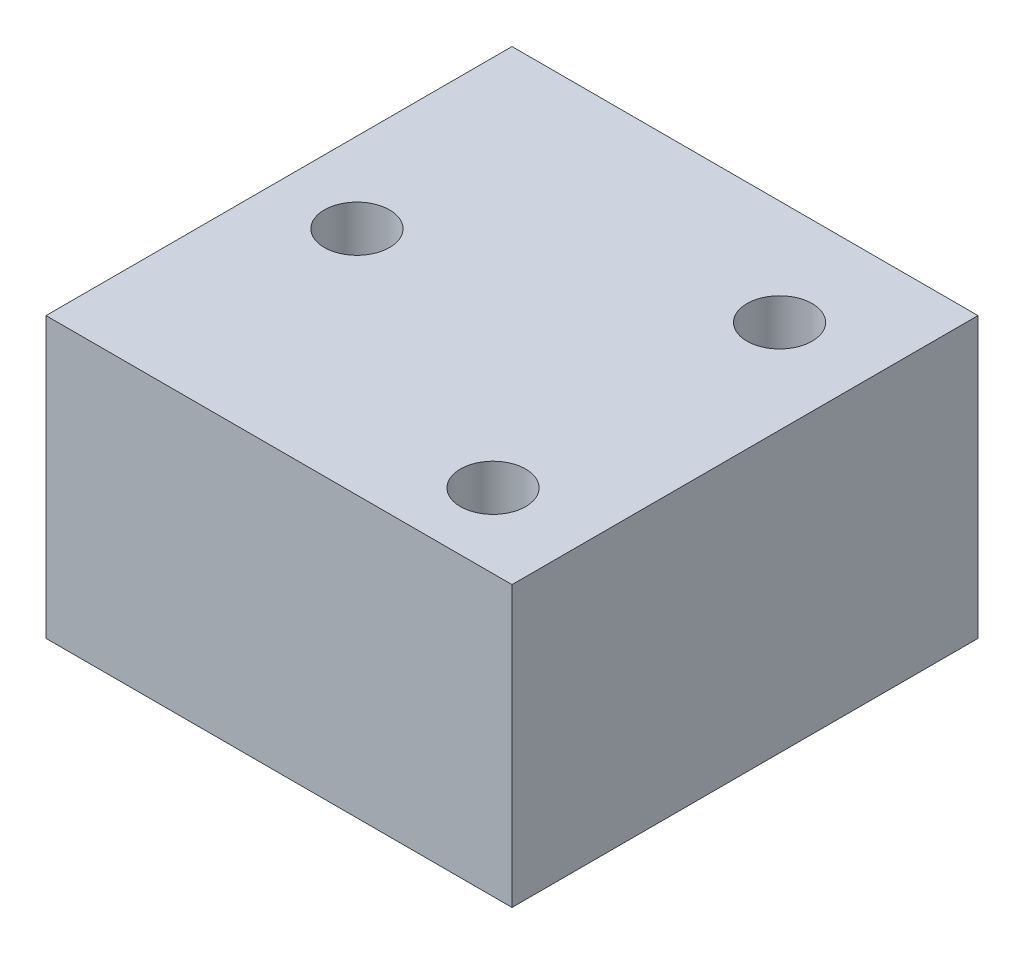
ISO-10303-21;
HEADER;
FILE_DESCRIPTION(('STEP AP214'),'2;1');
FILE_NAME('part.step','',(''),(''),'','','');
FILE_SCHEMA(('AUTOMOTIVE_DESIGN { 1 0 10303 214 1 1 1 1 }'));
ENDSEC;
DATA;
#1=APPLICATION_CONTEXT('core data for automotive mechanical design processes');
#2=APPLICATION_PROTOCOL_DEFINITION('international standard','automotive_design',2000,#1);
#3=PRODUCT_CONTEXT('',#1,'mechanical');
#4=PRODUCT('Part','Part','',(#3));
#5=PRODUCT_RELATED_PRODUCT_CATEGORY('part','',(#4));
#6=PRODUCT_DEFINITION_FORMATION('','',#4);
#7=PRODUCT_DEFINITION_CONTEXT('part definition',#1,'design');
#8=PRODUCT_DEFINITION('design','',#6,#7);
#9=PRODUCT_DEFINITION_SHAPE('','',#8);
#10=(LENGTH_UNIT() NAMED_UNIT(*) SI_UNIT(.MILLI.,.METRE.));
#11=(NAMED_UNIT(*) PLANE_ANGLE_UNIT() SI_UNIT($,.RADIAN.));
#12=(NAMED_UNIT(*) SI_UNIT($,.STERADIAN.) SOLID_ANGLE_UNIT());
#13=UNCERTAINTY_MEASURE_WITH_UNIT(LENGTH_MEASURE(1.E-05),#10,'distance_accuracy_value','');
#14=(GEOMETRIC_REPRESENTATION_CONTEXT(3) GLOBAL_UNCERTAINTY_ASSIGNED_CONTEXT((#13)) GLOBAL_UNIT_ASSIGNED_CONTEXT((#10,
#11,#12)) REPRESENTATION_CONTEXT('',''));
#15=CARTESIAN_POINT('',(0.,0.,0.));
#16=DIRECTION('',(0.,0.,1.));
#17=DIRECTION('',(1.,0.,0.));
#18=AXIS2_PLACEMENT_3D('',#15,#16,#17);
#19=CARTESIAN_POINT('',(0.,30.,0.));
#20=DIRECTION('',(1.,0.,0.));
#21=DIRECTION('',(0.,0.,-1.));
#22=AXIS2_PLACEMENT_3D('',#19,#20,#21);
#23=PLANE('',#22);
#24=DIRECTION('',(0.,0.,1.));
#25=VECTOR('',#24,1.);
#26=CARTESIAN_POINT('',(0.,0.,0.));
#27=LINE('',#26,#25);
#28=CARTESIAN_POINT('',(0.,0.,-50.));
#29=VERTEX_POINT('',#28);
#30=CARTESIAN_POINT('',(0.,0.,0.));
#31=VERTEX_POINT('',#30);
#32=EDGE_CURVE('E107',#29,#31,#27,.T.);
#33=ORIENTED_EDGE('',*,*,#32,.T.);
#34=DIRECTION('',(0.,-1.,0.));
#35=VECTOR('',#34,1.);
#36=CARTESIAN_POINT('',(0.,30.,0.));
#37=LINE('',#36,#35);
#38=CARTESIAN_POINT('',(0.,30.,0.));
#39=VERTEX_POINT('',#38);
#40=EDGE_CURVE('E11',#39,#31,#37,.T.);
#41=ORIENTED_EDGE('',*,*,#40,.F.);
#42=DIRECTION('',(0.,0.,1.));
#43=VECTOR('',#42,1.);
#44=CARTESIAN_POINT('',(0.,30.,0.));
#45=LINE('',#44,#43);
#46=CARTESIAN_POINT('',(0.,30.,-50.));
#47=VERTEX_POINT('',#46);
#48=EDGE_CURVE('E91',#47,#39,#45,.T.);
#49=ORIENTED_EDGE('',*,*,#48,.F.);
#50=DIRECTION('',(0.,-1.,0.));
#51=VECTOR('',#50,1.);
#52=CARTESIAN_POINT('',(0.,30.,-50.));
#53=LINE('',#52,#51);
#54=EDGE_CURVE('E103',#47,#29,#53,.T.);
#55=ORIENTED_EDGE('',*,*,#54,.T.);
#56=EDGE_LOOP('',(#33,#41,#49,#55));
#57=FACE_BOUND('',#56,.T.);
#58=ADVANCED_FACE('F39',(#57),#23,.F.);
#59=CARTESIAN_POINT('',(0.,30.,0.));
#60=DIRECTION('',(0.,0.,-1.));
#61=DIRECTION('',(-1.,0.,0.));
#62=AXIS2_PLACEMENT_3D('',#59,#60,#61);
#63=PLANE('',#62);
#64=DIRECTION('',(1.,0.,0.));
#65=VECTOR('',#64,1.);
#66=CARTESIAN_POINT('',(0.,0.,0.));
#67=LINE('',#66,#65);
#68=CARTESIAN_POINT('',(50.,0.,0.));
#69=VERTEX_POINT('',#68);
#70=EDGE_CURVE('E96',#31,#69,#67,.T.);
#71=ORIENTED_EDGE('',*,*,#70,.T.);
#72=DIRECTION('',(0.,-1.,0.));
#73=VECTOR('',#72,1.);
#74=CARTESIAN_POINT('',(50.,30.,0.));
#75=LINE('',#74,#73);
#76=CARTESIAN_POINT('',(50.,30.,0.));
#77=VERTEX_POINT('',#76);
#78=EDGE_CURVE('E48',#77,#69,#75,.T.);
#79=ORIENTED_EDGE('',*,*,#78,.F.);
#80=DIRECTION('',(1.,0.,0.));
#81=VECTOR('',#80,1.);
#82=CARTESIAN_POINT('',(0.,30.,0.));
#83=LINE('',#82,#81);
#84=EDGE_CURVE('E86',#39,#77,#83,.T.);
#85=ORIENTED_EDGE('',*,*,#84,.F.);
#86=ORIENTED_EDGE('',*,*,#40,.T.);
#87=EDGE_LOOP('',(#71,#79,#85,#86));
#88=FACE_BOUND('',#87,.T.);
#89=ADVANCED_FACE('F95',(#88),#63,.F.);
#90=CARTESIAN_POINT('',(50.,30.,0.));
#91=DIRECTION('',(-1.,0.,0.));
#92=DIRECTION('',(0.,0.,1.));
#93=AXIS2_PLACEMENT_3D('',#90,#91,#92);
#94=PLANE('',#93);
#95=DIRECTION('',(0.,0.,-1.));
#96=VECTOR('',#95,1.);
#97=CARTESIAN_POINT('',(50.,0.,0.));
#98=LINE('',#97,#96);
#99=CARTESIAN_POINT('',(50.,0.,-50.));
#100=VERTEX_POINT('',#99);
#101=EDGE_CURVE('E73',#69,#100,#98,.T.);
#102=ORIENTED_EDGE('',*,*,#101,.T.);
#103=DIRECTION('',(0.,-1.,0.));
#104=VECTOR('',#103,1.);
#105=CARTESIAN_POINT('',(50.,30.,-50.));
#106=LINE('',#105,#104);
#107=CARTESIAN_POINT('',(50.,30.,-50.));
#108=VERTEX_POINT('',#107);
#109=EDGE_CURVE('E98',#108,#100,#106,.T.);
#110=ORIENTED_EDGE('',*,*,#109,.F.);
#111=DIRECTION('',(0.,0.,-1.));
#112=VECTOR('',#111,1.);
#113=CARTESIAN_POINT('',(50.,30.,0.));
#114=LINE('',#113,#112);
#115=EDGE_CURVE('E89',#77,#108,#114,.T.);
#116=ORIENTED_EDGE('',*,*,#115,.F.);
#117=ORIENTED_EDGE('',*,*,#78,.T.);
#118=EDGE_LOOP('',(#102,#110,#116,#117));
#119=FACE_BOUND('',#118,.T.);
#120=ADVANCED_FACE('F99',(#119),#94,.F.);
#121=CARTESIAN_POINT('',(0.,30.,-50.));
#122=DIRECTION('',(0.,0.,1.));
#123=DIRECTION('',(1.,0.,0.));
#124=AXIS2_PLACEMENT_3D('',#121,#122,#123);
#125=PLANE('',#124);
#126=DIRECTION('',(-1.,0.,0.));
#127=VECTOR('',#126,1.);
#128=CARTESIAN_POINT('',(0.,0.,-50.));
#129=LINE('',#128,#127);
#130=EDGE_CURVE('E79',#100,#29,#129,.T.);
#131=ORIENTED_EDGE('',*,*,#130,.T.);
#132=ORIENTED_EDGE('',*,*,#54,.F.);
#133=DIRECTION('',(-1.,0.,0.));
#134=VECTOR('',#133,1.);
#135=CARTESIAN_POINT('',(0.,30.,-50.));
#136=LINE('',#135,#134);
#137=EDGE_CURVE('E56',#108,#47,#136,.T.);
#138=ORIENTED_EDGE('',*,*,#137,.F.);
#139=ORIENTED_EDGE('',*,*,#109,.T.);
#140=EDGE_LOOP('',(#131,#132,#138,#139));
#141=FACE_BOUND('',#140,.T.);
#142=ADVANCED_FACE('F121',(#141),#125,.F.);
#143=CARTESIAN_POINT('',(0.,30.,0.));
#144=DIRECTION('',(0.,-1.,0.));
#145=DIRECTION('',(0.,0.,-1.));
#146=AXIS2_PLACEMENT_3D('',#143,#144,#145);
#147=PLANE('',#146);
#148=CARTESIAN_POINT('',(39.9863553582119,30.,-38.722868723796));
#149=DIRECTION('',(0.,1.,0.));
#150=DIRECTION('',(0.,0.,1.));
#151=AXIS2_PLACEMENT_3D('',#148,#149,#150);
#152=CIRCLE('',#151,3.5);
#153=CARTESIAN_POINT('',(39.9863553582119,30.,-35.222868723796));
#154=VERTEX_POINT('',#153);
#155=EDGE_CURVE('E144',#154,#154,#152,.T.);
#156=ORIENTED_EDGE('',*,*,#155,.F.);
#157=EDGE_LOOP('',(#156));
#158=FACE_BOUND('',#157,.T.);
#159=CARTESIAN_POINT('',(39.9863553582119,30.,-7.9780272863402));
#160=DIRECTION('',(0.,1.,0.));
#161=DIRECTION('',(0.,0.,1.));
#162=AXIS2_PLACEMENT_3D('',#159,#160,#161);
#163=CIRCLE('',#162,3.5);
#164=CARTESIAN_POINT('',(39.9863553582119,30.,-4.4780272863402));
#165=VERTEX_POINT('',#164);
#166=EDGE_CURVE('E136',#165,#165,#163,.T.);
#167=ORIENTED_EDGE('',*,*,#166,.F.);
#168=EDGE_LOOP('',(#167));
#169=FACE_BOUND('',#168,.T.);
#170=CARTESIAN_POINT('',(8.60977060354809,30.,-24.7543220433081));
#171=DIRECTION('',(0.,1.,0.));
#172=DIRECTION('',(0.,0.,1.));
#173=AXIS2_PLACEMENT_3D('',#170,#171,#172);
#174=CIRCLE('',#173,3.5);
#175=CARTESIAN_POINT('',(8.60977060354809,30.,-21.2543220433081));
#176=VERTEX_POINT('',#175);
#177=EDGE_CURVE('E128',#176,#176,#174,.T.);
#178=ORIENTED_EDGE('',*,*,#177,.F.);
#179=EDGE_LOOP('',(#178));
#180=FACE_BOUND('',#179,.T.);
#181=ORIENTED_EDGE('',*,*,#48,.T.);
#182=ORIENTED_EDGE('',*,*,#84,.T.);
#183=ORIENTED_EDGE('',*,*,#115,.T.);
#184=ORIENTED_EDGE('',*,*,#137,.T.);
#185=EDGE_LOOP('',(#181,#182,#183,#184));
#186=FACE_BOUND('',#185,.T.);
#187=ADVANCED_FACE('F87',(#158,#169,#180,#186),#147,.F.);
#188=CARTESIAN_POINT('',(0.,0.,0.));
#189=DIRECTION('',(0.,-1.,0.));
#190=DIRECTION('',(0.,0.,-1.));
#191=AXIS2_PLACEMENT_3D('',#188,#189,#190);
#192=PLANE('',#191);
#193=ORIENTED_EDGE('',*,*,#32,.F.);
#194=ORIENTED_EDGE('',*,*,#130,.F.);
#195=ORIENTED_EDGE('',*,*,#101,.F.);
#196=ORIENTED_EDGE('',*,*,#70,.F.);
#197=EDGE_LOOP('',(#193,#194,#195,#196));
#198=FACE_BOUND('',#197,.T.);
#199=ADVANCED_FACE('F124',(#198),#192,.T.);
#200=CARTESIAN_POINT('',(8.60977060354809,20.,-24.7543220433081));
#201=DIRECTION('',(0.,1.,0.));
#202=DIRECTION('',(0.,0.,1.));
#203=AXIS2_PLACEMENT_3D('',#200,#201,#202);
#204=CYLINDRICAL_SURFACE('',#203,3.5);
#205=CARTESIAN_POINT('',(8.60977060354809,20.,-24.7543220433081));
#206=DIRECTION('',(0.,1.,0.));
#207=DIRECTION('',(0.,0.,1.));
#208=AXIS2_PLACEMENT_3D('',#205,#206,#207);
#209=CIRCLE('',#208,3.5);
#210=CARTESIAN_POINT('',(8.60977060354809,20.,-21.2543220433081));
#211=VERTEX_POINT('',#210);
#212=EDGE_CURVE('E132',#211,#211,#209,.T.);
#213=ORIENTED_EDGE('',*,*,#212,.F.);
#214=EDGE_LOOP('',(#213));
#215=FACE_BOUND('',#214,.T.);
#216=ORIENTED_EDGE('',*,*,#177,.T.);
#217=EDGE_LOOP('',(#216));
#218=FACE_BOUND('',#217,.T.);
#219=ADVANCED_FACE('F168',(#215,#218),#204,.F.);
#220=CARTESIAN_POINT('',(8.60977060354809,20.,-24.7543220433081));
#221=DIRECTION('',(0.,1.,0.));
#222=DIRECTION('',(0.,0.,1.));
#223=AXIS2_PLACEMENT_3D('',#220,#221,#222);
#224=PLANE('',#223);
#225=ORIENTED_EDGE('',*,*,#212,.T.);
#226=EDGE_LOOP('',(#225));
#227=FACE_BOUND('',#226,.T.);
#228=ADVANCED_FACE('F170',(#227),#224,.T.);
#229=CARTESIAN_POINT('',(39.9863553582119,20.,-7.9780272863402));
#230=DIRECTION('',(0.,1.,0.));
#231=DIRECTION('',(0.,0.,1.));
#232=AXIS2_PLACEMENT_3D('',#229,#230,#231);
#233=CYLINDRICAL_SURFACE('',#232,3.5);
#234=CARTESIAN_POINT('',(39.9863553582119,20.,-7.9780272863402));
#235=DIRECTION('',(0.,1.,0.));
#236=DIRECTION('',(0.,0.,1.));
#237=AXIS2_PLACEMENT_3D('',#234,#235,#236);
#238=CIRCLE('',#237,3.5);
#239=CARTESIAN_POINT('',(39.9863553582119,20.,-4.4780272863402));
#240=VERTEX_POINT('',#239);
#241=EDGE_CURVE('E140',#240,#240,#238,.T.);
#242=ORIENTED_EDGE('',*,*,#241,.F.);
#243=EDGE_LOOP('',(#242));
#244=FACE_BOUND('',#243,.T.);
#245=ORIENTED_EDGE('',*,*,#166,.T.);
#246=EDGE_LOOP('',(#245));
#247=FACE_BOUND('',#246,.T.);
#248=ADVANCED_FACE('F177',(#244,#247),#233,.F.);
#249=CARTESIAN_POINT('',(39.9863553582119,20.,-7.9780272863402));
#250=DIRECTION('',(0.,1.,0.));
#251=DIRECTION('',(0.,0.,1.));
#252=AXIS2_PLACEMENT_3D('',#249,#250,#251);
#253=PLANE('',#252);
#254=ORIENTED_EDGE('',*,*,#241,.T.);
#255=EDGE_LOOP('',(#254));
#256=FACE_BOUND('',#255,.T.);
#257=ADVANCED_FACE('F157',(#256),#253,.T.);
#258=CARTESIAN_POINT('',(39.9863553582119,20.,-38.722868723796));
#259=DIRECTION('',(0.,1.,0.));
#260=DIRECTION('',(0.,0.,1.));
#261=AXIS2_PLACEMENT_3D('',#258,#259,#260);
#262=CYLINDRICAL_SURFACE('',#261,3.5);
#263=CARTESIAN_POINT('',(39.9863553582119,20.,-38.722868723796));
#264=DIRECTION('',(0.,1.,0.));
#265=DIRECTION('',(0.,0.,1.));
#266=AXIS2_PLACEMENT_3D('',#263,#264,#265);
#267=CIRCLE('',#266,3.5);
#268=CARTESIAN_POINT('',(39.9863553582119,20.,-35.222868723796));
#269=VERTEX_POINT('',#268);
#270=EDGE_CURVE('E111',#269,#269,#267,.T.);
#271=ORIENTED_EDGE('',*,*,#270,.F.);
#272=EDGE_LOOP('',(#271));
#273=FACE_BOUND('',#272,.T.);
#274=ORIENTED_EDGE('',*,*,#155,.T.);
#275=EDGE_LOOP('',(#274));
#276=FACE_BOUND('',#275,.T.);
#277=ADVANCED_FACE('F154',(#273,#276),#262,.F.);
#278=CARTESIAN_POINT('',(39.9863553582119,20.,-38.722868723796));
#279=DIRECTION('',(0.,1.,0.));
#280=DIRECTION('',(0.,0.,1.));
#281=AXIS2_PLACEMENT_3D('',#278,#279,#280);
#282=PLANE('',#281);
#283=ORIENTED_EDGE('',*,*,#270,.T.);
#284=EDGE_LOOP('',(#283));
#285=FACE_BOUND('',#284,.T.);
#286=ADVANCED_FACE('F152',(#285),#282,.T.);
#287=CLOSED_SHELL('',(#58,#89,#120,#142,#187,#199,#219,#228,#248,#257,#277,#286));
#288=MANIFOLD_SOLID_BREP('B2',#287);
#289=ADVANCED_BREP_SHAPE_REPRESENTATION('',(#18,#288),#14);
#290=SHAPE_DEFINITION_REPRESENTATION(#9,#289);
ENDSEC;
END-ISO-10303-21;
